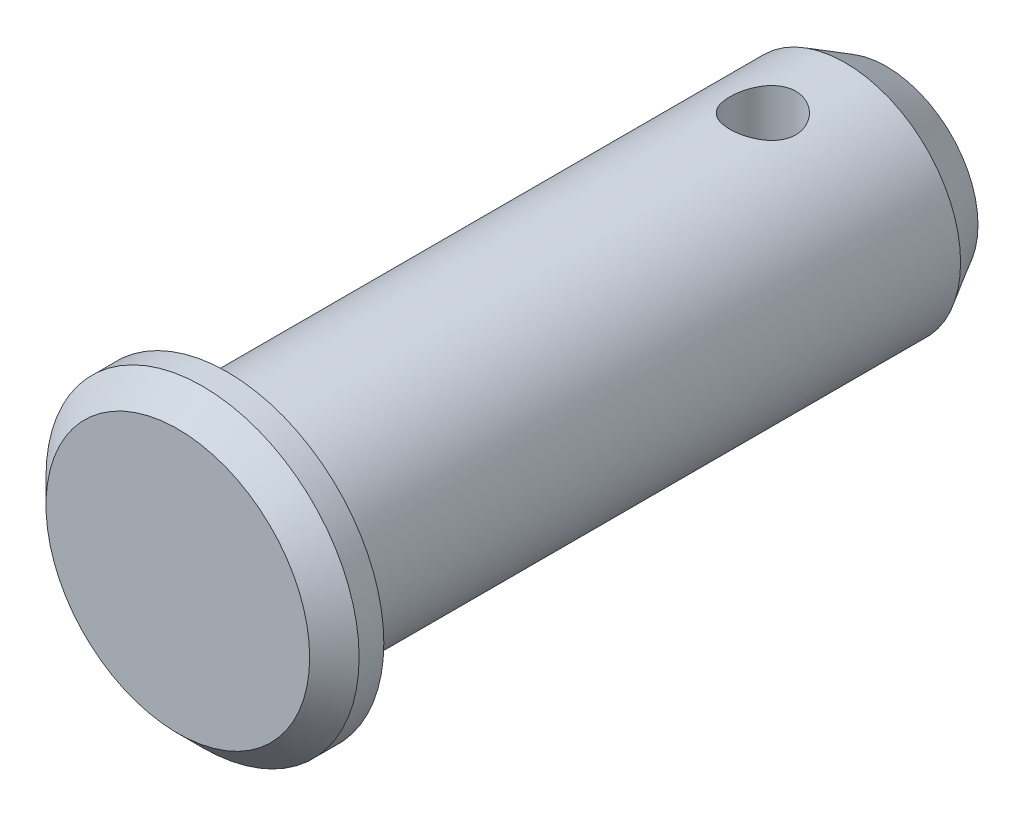
ISO-10303-21;
HEADER;
FILE_DESCRIPTION(('STEP AP214'),'2;1');
FILE_NAME('part.step','',(''),(''),'','','');
FILE_SCHEMA(('AUTOMOTIVE_DESIGN { 1 0 10303 214 1 1 1 1 }'));
ENDSEC;
DATA;
#1=APPLICATION_CONTEXT('core data for automotive mechanical design processes');
#2=APPLICATION_PROTOCOL_DEFINITION('international standard','automotive_design',2000,#1);
#3=PRODUCT_CONTEXT('',#1,'mechanical');
#4=PRODUCT('Part','Part','',(#3));
#5=PRODUCT_RELATED_PRODUCT_CATEGORY('part','',(#4));
#6=PRODUCT_DEFINITION_FORMATION('','',#4);
#7=PRODUCT_DEFINITION_CONTEXT('part definition',#1,'design');
#8=PRODUCT_DEFINITION('design','',#6,#7);
#9=PRODUCT_DEFINITION_SHAPE('','',#8);
#10=(LENGTH_UNIT() NAMED_UNIT(*) SI_UNIT(.MILLI.,.METRE.));
#11=(NAMED_UNIT(*) PLANE_ANGLE_UNIT() SI_UNIT($,.RADIAN.));
#12=(NAMED_UNIT(*) SI_UNIT($,.STERADIAN.) SOLID_ANGLE_UNIT());
#13=UNCERTAINTY_MEASURE_WITH_UNIT(LENGTH_MEASURE(1.E-05),#10,'distance_accuracy_value','');
#14=(GEOMETRIC_REPRESENTATION_CONTEXT(3) GLOBAL_UNCERTAINTY_ASSIGNED_CONTEXT((#13)) GLOBAL_UNIT_ASSIGNED_CONTEXT((#10,
#11,#12)) REPRESENTATION_CONTEXT('',''));
#15=CARTESIAN_POINT('',(0.,0.,0.));
#16=DIRECTION('',(0.,0.,1.));
#17=DIRECTION('',(1.,0.,0.));
#18=AXIS2_PLACEMENT_3D('',#15,#16,#17);
#19=CARTESIAN_POINT('',(0.,0.,21.5));
#20=DIRECTION('',(0.,0.,-1.));
#21=DIRECTION('',(-1.,0.,0.));
#22=AXIS2_PLACEMENT_3D('',#19,#20,#21);
#23=PLANE('',#22);
#24=CARTESIAN_POINT('',(0.,0.,21.5));
#25=DIRECTION('',(0.,0.,1.));
#26=DIRECTION('',(1.,0.,0.));
#27=AXIS2_PLACEMENT_3D('',#24,#25,#26);
#28=CIRCLE('',#27,8.);
#29=CARTESIAN_POINT('',(8.,0.,21.5));
#30=VERTEX_POINT('',#29);
#31=EDGE_CURVE('E10',#30,#30,#28,.T.);
#32=ORIENTED_EDGE('',*,*,#31,.T.);
#33=EDGE_LOOP('',(#32));
#34=FACE_BOUND('',#33,.T.);
#35=ADVANCED_FACE('F33',(#34),#23,.F.);
#36=CARTESIAN_POINT('',(0.,0.,20.));
#37=DIRECTION('',(0.,0.,-1.));
#38=DIRECTION('',(-1.,0.,0.));
#39=AXIS2_PLACEMENT_3D('',#36,#37,#38);
#40=CONICAL_SURFACE('',#39,9.5,0.785398163397447);
#41=ORIENTED_EDGE('',*,*,#31,.F.);
#42=EDGE_LOOP('',(#41));
#43=FACE_BOUND('',#42,.T.);
#44=CARTESIAN_POINT('',(0.,0.,20.));
#45=DIRECTION('',(0.,0.,1.));
#46=DIRECTION('',(1.,0.,0.));
#47=AXIS2_PLACEMENT_3D('',#44,#45,#46);
#48=CIRCLE('',#47,9.5);
#49=CARTESIAN_POINT('',(9.5,0.,20.));
#50=VERTEX_POINT('',#49);
#51=EDGE_CURVE('E45',#50,#50,#48,.T.);
#52=ORIENTED_EDGE('',*,*,#51,.T.);
#53=EDGE_LOOP('',(#52));
#54=FACE_BOUND('',#53,.T.);
#55=ADVANCED_FACE('F82',(#43,#54),#40,.T.);
#56=CARTESIAN_POINT('',(0.,0.,21.5));
#57=DIRECTION('',(0.,0.,1.));
#58=DIRECTION('',(1.,0.,0.));
#59=AXIS2_PLACEMENT_3D('',#56,#57,#58);
#60=CYLINDRICAL_SURFACE('',#59,9.5);
#61=ORIENTED_EDGE('',*,*,#51,.F.);
#62=EDGE_LOOP('',(#61));
#63=FACE_BOUND('',#62,.T.);
#64=CARTESIAN_POINT('',(0.,0.,18.5));
#65=DIRECTION('',(0.,0.,1.));
#66=DIRECTION('',(1.,0.,0.));
#67=AXIS2_PLACEMENT_3D('',#64,#65,#66);
#68=CIRCLE('',#67,9.5);
#69=CARTESIAN_POINT('',(9.5,0.,18.5));
#70=VERTEX_POINT('',#69);
#71=EDGE_CURVE('E50',#70,#70,#68,.T.);
#72=ORIENTED_EDGE('',*,*,#71,.T.);
#73=EDGE_LOOP('',(#72));
#74=FACE_BOUND('',#73,.T.);
#75=ADVANCED_FACE('F86',(#63,#74),#60,.T.);
#76=CARTESIAN_POINT('',(0.,0.,18.5));
#77=DIRECTION('',(0.,0.,1.));
#78=DIRECTION('',(1.,0.,0.));
#79=AXIS2_PLACEMENT_3D('',#76,#77,#78);
#80=PLANE('',#79);
#81=ORIENTED_EDGE('',*,*,#71,.F.);
#82=EDGE_LOOP('',(#81));
#83=FACE_BOUND('',#82,.T.);
#84=CARTESIAN_POINT('',(0.,0.,18.5));
#85=DIRECTION('',(0.,0.,1.));
#86=DIRECTION('',(1.,0.,0.));
#87=AXIS2_PLACEMENT_3D('',#84,#85,#86);
#88=CIRCLE('',#87,7.);
#89=CARTESIAN_POINT('',(7.,0.,18.5));
#90=VERTEX_POINT('',#89);
#91=EDGE_CURVE('E103',#90,#90,#88,.T.);
#92=ORIENTED_EDGE('',*,*,#91,.T.);
#93=EDGE_LOOP('',(#92));
#94=FACE_BOUND('',#93,.T.);
#95=ADVANCED_FACE('F77',(#83,#94),#80,.F.);
#96=CARTESIAN_POINT('',(0.,0.,21.5));
#97=DIRECTION('',(0.,0.,1.));
#98=DIRECTION('',(1.,0.,0.));
#99=AXIS2_PLACEMENT_3D('',#96,#97,#98);
#100=CYLINDRICAL_SURFACE('',#99,7.);
#101=CARTESIAN_POINT('',(0.,-7.,-12.));
#102=CARTESIAN_POINT('',(0.109954902377251,-6.99999869294341,-12.0000019395619));
#103=CARTESIAN_POINT('',(0.219929747872581,-6.99738417402043,-12.0090977889761));
#104=CARTESIAN_POINT('',(0.436691991196989,-6.98720905945103,-12.0451642701023));
#105=CARTESIAN_POINT('',(0.543478166829615,-6.97964659210084,-12.0721416660741));
#106=CARTESIAN_POINT('',(0.750704300737871,-6.96040691349073,-12.1430080384165));
#107=CARTESIAN_POINT('',(0.851152880848224,-6.94873544106341,-12.1868734361519));
#108=CARTESIAN_POINT('',(1.04326876112927,-6.92249978316544,-12.2901779914783));
#109=CARTESIAN_POINT('',(1.13493514117816,-6.90793529508023,-12.3496187784904));
#110=CARTESIAN_POINT('',(1.30929444685895,-6.8770473462558,-12.4840350106729));
#111=CARTESIAN_POINT('',(1.39172372238094,-6.86069041945191,-12.5593447538553));
#112=CARTESIAN_POINT('',(1.54297135792435,-6.82826734915641,-12.7226477431377));
#113=CARTESIAN_POINT('',(1.61178767707782,-6.81220124959344,-12.8106428876322));
#114=CARTESIAN_POINT('',(1.7351979000643,-6.78183014875388,-12.9989935827909));
#115=CARTESIAN_POINT('',(1.78947821103348,-6.76756702506018,-13.0995619850649));
#116=CARTESIAN_POINT('',(1.8802517055398,-6.74291343840667,-13.3088720117508));
#117=CARTESIAN_POINT('',(1.91674871555719,-6.73252214244871,-13.4176118720709));
#118=CARTESIAN_POINT('',(1.96998433013875,-6.71713608196016,-13.6372347631655));
#119=CARTESIAN_POINT('',(1.9872055320285,-6.71200978570011,-13.7479913627678));
#120=CARTESIAN_POINT('',(2.00290667789184,-6.70734208201995,-13.9709311484461));
#121=CARTESIAN_POINT('',(2.00139069409621,-6.70779946107612,-14.0831140192502));
#122=CARTESIAN_POINT('',(1.98004134762903,-6.71413034409934,-14.3018686114562));
#123=CARTESIAN_POINT('',(1.96080325728391,-6.71982782697936,-14.4085043511808));
#124=CARTESIAN_POINT('',(1.90551386085789,-6.73571348382811,-14.6169672196276));
#125=CARTESIAN_POINT('',(1.8694610348125,-6.74590206376403,-14.7187939127205));
#126=CARTESIAN_POINT('',(1.78110681137812,-6.7697686351608,-14.9162462444318));
#127=CARTESIAN_POINT('',(1.72860551172881,-6.78348916405649,-15.0117770724017));
#128=CARTESIAN_POINT('',(1.60898379167885,-6.81285216882059,-15.1928765612134));
#129=CARTESIAN_POINT('',(1.54186011673345,-6.82849507221912,-15.2784429977349));
#130=CARTESIAN_POINT('',(1.39190399673021,-6.86066250656356,-15.4405723756064));
#131=CARTESIAN_POINT('',(1.30857487484533,-6.87719804572366,-15.5166744759672));
#132=CARTESIAN_POINT('',(1.13013228238622,-6.90876247218345,-15.6539260036403));
#133=CARTESIAN_POINT('',(1.03501820148189,-6.92379128137826,-15.7150746560417));
#134=CARTESIAN_POINT('',(0.834923073091445,-6.95076528065502,-15.820928734774));
#135=CARTESIAN_POINT('',(0.729889817810005,-6.96269275497229,-15.8655402868042));
#136=CARTESIAN_POINT('',(0.51339322996747,-6.98199251487585,-15.9363338914168));
#137=CARTESIAN_POINT('',(0.401931525810147,-6.98936594856255,-15.9625205892453));
#138=CARTESIAN_POINT('',(0.17966638864435,-6.99854874514672,-15.9949732857095));
#139=CARTESIAN_POINT('',(0.0689613468605084,-7.00053272850599,-16.001864695373));
#140=CARTESIAN_POINT('',(-0.152026526805583,-6.99922084707091,-15.997272733699));
#141=CARTESIAN_POINT('',(-0.262309407757108,-6.99592561580629,-15.9857915671541));
#142=CARTESIAN_POINT('',(-0.477018633430315,-6.98453926685206,-15.9452895556837));
#143=CARTESIAN_POINT('',(-0.581518211734843,-6.97654613017679,-15.9166268186766));
#144=CARTESIAN_POINT('',(-0.78420868620564,-6.95667998741884,-15.8429994980153));
#145=CARTESIAN_POINT('',(-0.882398851248717,-6.94480653265874,-15.7980330291107));
#146=CARTESIAN_POINT('',(-1.07204168512003,-6.91809961169145,-15.6919766633549));
#147=CARTESIAN_POINT('',(-1.16330248654009,-6.9032076317834,-15.6305588011747));
#148=CARTESIAN_POINT('',(-1.33443852805947,-6.87217947098441,-15.4937474940489));
#149=CARTESIAN_POINT('',(-1.41431117084304,-6.85604300755108,-15.4183508699354));
#150=CARTESIAN_POINT('',(-1.56310642834007,-6.82368619629444,-15.2527906579506));
#151=CARTESIAN_POINT('',(-1.63158542740713,-6.80748036858305,-15.162224724441));
#152=CARTESIAN_POINT('',(-1.75239531606757,-6.77738894734787,-14.9705374113753));
#153=CARTESIAN_POINT('',(-1.8047267674867,-6.76350327310609,-14.8694163992287));
#154=CARTESIAN_POINT('',(-1.89137454118278,-6.73978651242836,-14.6599087890248));
#155=CARTESIAN_POINT('',(-1.92578633239654,-6.72993400029434,-14.5515642365024));
#156=CARTESIAN_POINT('',(-1.9757945006787,-6.71542456669526,-14.3302900644252));
#157=CARTESIAN_POINT('',(-1.99139657901587,-6.71076607094367,-14.2173618449236));
#158=CARTESIAN_POINT('',(-2.00298024246851,-6.70731703127619,-13.9947039670632));
#159=CARTESIAN_POINT('',(-1.99968027644405,-6.70831160808103,-13.8850144954433));
#160=CARTESIAN_POINT('',(-1.97524710957466,-6.71554597206102,-13.6678252693383));
#161=CARTESIAN_POINT('',(-1.95411450379873,-6.72178558421114,-13.5603254419081));
#162=CARTESIAN_POINT('',(-1.89505968816675,-6.73866977160528,-13.3516216288314));
#163=CARTESIAN_POINT('',(-1.85731091786365,-6.74926877048974,-13.2503646129888));
#164=CARTESIAN_POINT('',(-1.76622949301581,-6.77367302842112,-13.0555412655078));
#165=CARTESIAN_POINT('',(-1.71289408043152,-6.78747885482392,-12.9619762987268));
#166=CARTESIAN_POINT('',(-1.59006546534828,-6.81731668949935,-12.7818164781947));
#167=CARTESIAN_POINT('',(-1.52009227722732,-6.83340763179064,-12.695558608658));
#168=CARTESIAN_POINT('',(-1.36685984037935,-6.86569845092232,-12.5357761041902));
#169=CARTESIAN_POINT('',(-1.28359725072856,-6.88189835417168,-12.4622546808892));
#170=CARTESIAN_POINT('',(-1.10357432086539,-6.91307959572365,-12.3281628156734));
#171=CARTESIAN_POINT('',(-1.00652250235978,-6.92801901037413,-12.2679730127304));
#172=CARTESIAN_POINT('',(-0.80325052964666,-6.95451395777971,-12.164854214978));
#173=CARTESIAN_POINT('',(-0.697035424114738,-6.96607133870287,-12.1219157880669));
#174=CARTESIAN_POINT('',(-0.492916315335033,-6.98327344725308,-12.0591524486046));
#175=CARTESIAN_POINT('',(-0.395763007624389,-6.98949684362077,-12.0370264633154));
#176=CARTESIAN_POINT('',(-0.199078368786366,-6.99786043852147,-12.0074503427579));
#177=CARTESIAN_POINT('',(-0.0995473576160912,-7.00000118333996,-11.9999982440231));
#178=CARTESIAN_POINT('',(0.,-7.,-12.));
#179=B_SPLINE_CURVE_WITH_KNOTS('',3,(#101,#102,#103,#104,#105,#106,#107,#108,#109,#110,#111,
#112,#113,#114,#115,#116,#117,#118,#119,#120,#121,#122,#123,#124,#125,#126,#127,#128,#129,#130,
#131,#132,#133,#134,#135,#136,#137,#138,#139,#140,#141,#142,#143,#144,#145,#146,#147,#148,#149,
#150,#151,#152,#153,#154,#155,#156,#157,#158,#159,#160,#161,#162,#163,#164,#165,#166,#167,#168,
#169,#170,#171,#172,#173,#174,#175,#176,#177,#178),.UNSPECIFIED.,.T.,.F.,(4,2,2,2,2,2,2,2,2,2,2,
2,2,2,2,2,2,2,2,2,2,2,2,2,2,2,2,2,2,2,2,2,2,2,2,2,2,2,4),(0.,0.329499312542344,0.65912333979518,
0.988288812895344,1.31748873543516,1.65447811530781,1.99151797873713,2.33533075300057,
2.67906951544809,3.0139950986275,3.34884789231233,3.67284785829333,3.99687711786126,
4.3250080329121,4.65321205577343,4.99378500602502,5.33437560155449,5.67687101104448,
6.01928004014612,6.350454576982,6.68158937434648,7.00605140479519,7.33055096575529,
7.66207525344451,7.99367503187788,8.33612104884334,8.67855514965298,9.01914573366139,
9.35963305787734,9.68726681616472,10.0148896418598,10.3391709629126,10.6635096999758,
10.9986765689036,11.3339278310847,11.6777797897016,12.0214434923409,12.3197946803794,
12.6181059442772),.UNSPECIFIED.);
#180=CARTESIAN_POINT('',(0.,-7.,-12.));
#181=VERTEX_POINT('',#180);
#182=EDGE_CURVE('E36',#181,#181,#179,.T.);
#183=ORIENTED_EDGE('',*,*,#182,.T.);
#184=EDGE_LOOP('',(#183));
#185=FACE_BOUND('',#184,.T.);
#186=CARTESIAN_POINT('',(0.,7.,-12.));
#187=CARTESIAN_POINT('',(-0.109954902377251,6.99999869294341,-12.0000019395619));
#188=CARTESIAN_POINT('',(-0.219929747872581,6.99738417402043,-12.0090977889761));
#189=CARTESIAN_POINT('',(-0.436691991196989,6.98720905945103,-12.0451642701023));
#190=CARTESIAN_POINT('',(-0.543478166829615,6.97964659210084,-12.0721416660741));
#191=CARTESIAN_POINT('',(-0.750704300737871,6.96040691349073,-12.1430080384165));
#192=CARTESIAN_POINT('',(-0.851152880848224,6.94873544106341,-12.1868734361519));
#193=CARTESIAN_POINT('',(-1.04326876112927,6.92249978316544,-12.2901779914783));
#194=CARTESIAN_POINT('',(-1.13493514117816,6.90793529508023,-12.3496187784904));
#195=CARTESIAN_POINT('',(-1.30929444685895,6.8770473462558,-12.4840350106729));
#196=CARTESIAN_POINT('',(-1.39172372238094,6.86069041945191,-12.5593447538553));
#197=CARTESIAN_POINT('',(-1.54297135792435,6.82826734915641,-12.7226477431377));
#198=CARTESIAN_POINT('',(-1.61178767707782,6.81220124959344,-12.8106428876322));
#199=CARTESIAN_POINT('',(-1.7351979000643,6.78183014875388,-12.9989935827909));
#200=CARTESIAN_POINT('',(-1.78947821103348,6.76756702506018,-13.0995619850649));
#201=CARTESIAN_POINT('',(-1.8802517055398,6.74291343840667,-13.3088720117508));
#202=CARTESIAN_POINT('',(-1.91674871555719,6.73252214244871,-13.4176118720709));
#203=CARTESIAN_POINT('',(-1.96998433013875,6.71713608196017,-13.6372347631655));
#204=CARTESIAN_POINT('',(-1.9872055320285,6.71200978570012,-13.7479913627678));
#205=CARTESIAN_POINT('',(-2.00290667789184,6.70734208201995,-13.9709311484461));
#206=CARTESIAN_POINT('',(-2.00139069409621,6.70779946107612,-14.0831140192502));
#207=CARTESIAN_POINT('',(-1.98004134762903,6.71413034409934,-14.3018686114562));
#208=CARTESIAN_POINT('',(-1.96080325728391,6.71982782697936,-14.4085043511808));
#209=CARTESIAN_POINT('',(-1.90551386085789,6.73571348382811,-14.6169672196276));
#210=CARTESIAN_POINT('',(-1.8694610348125,6.74590206376404,-14.7187939127205));
#211=CARTESIAN_POINT('',(-1.78110681137812,6.7697686351608,-14.9162462444318));
#212=CARTESIAN_POINT('',(-1.72860551172881,6.78348916405649,-15.0117770724017));
#213=CARTESIAN_POINT('',(-1.60898379167885,6.81285216882059,-15.1928765612134));
#214=CARTESIAN_POINT('',(-1.54186011673345,6.82849507221913,-15.2784429977349));
#215=CARTESIAN_POINT('',(-1.39190399673021,6.86066250656356,-15.4405723756064));
#216=CARTESIAN_POINT('',(-1.30857487484533,6.87719804572366,-15.5166744759672));
#217=CARTESIAN_POINT('',(-1.13013228238623,6.90876247218345,-15.6539260036403));
#218=CARTESIAN_POINT('',(-1.03501820148189,6.92379128137826,-15.7150746560417));
#219=CARTESIAN_POINT('',(-0.834923073091446,6.95076528065502,-15.820928734774));
#220=CARTESIAN_POINT('',(-0.729889817810005,6.96269275497229,-15.8655402868042));
#221=CARTESIAN_POINT('',(-0.51339322996747,6.98199251487585,-15.9363338914168));
#222=CARTESIAN_POINT('',(-0.401931525810147,6.98936594856255,-15.9625205892453));
#223=CARTESIAN_POINT('',(-0.179666388644351,6.99854874514672,-15.9949732857095));
#224=CARTESIAN_POINT('',(-0.0689613468605094,7.00053272850599,-16.001864695373));
#225=CARTESIAN_POINT('',(0.152026526805582,6.99922084707091,-15.997272733699));
#226=CARTESIAN_POINT('',(0.262309407757107,6.99592561580629,-15.9857915671541));
#227=CARTESIAN_POINT('',(0.477018633430314,6.98453926685206,-15.9452895556837));
#228=CARTESIAN_POINT('',(0.581518211734843,6.97654613017679,-15.9166268186766));
#229=CARTESIAN_POINT('',(0.78420868620564,6.95667998741884,-15.8429994980153));
#230=CARTESIAN_POINT('',(0.882398851248716,6.94480653265874,-15.7980330291107));
#231=CARTESIAN_POINT('',(1.07204168512003,6.91809961169145,-15.6919766633549));
#232=CARTESIAN_POINT('',(1.16330248654009,6.9032076317834,-15.6305588011747));
#233=CARTESIAN_POINT('',(1.33443852805947,6.87217947098441,-15.4937474940489));
#234=CARTESIAN_POINT('',(1.41431117084304,6.85604300755107,-15.4183508699354));
#235=CARTESIAN_POINT('',(1.56310642834007,6.82368619629443,-15.2527906579506));
#236=CARTESIAN_POINT('',(1.63158542740713,6.80748036858305,-15.162224724441));
#237=CARTESIAN_POINT('',(1.75239531606757,6.77738894734787,-14.9705374113753));
#238=CARTESIAN_POINT('',(1.8047267674867,6.76350327310608,-14.8694163992287));
#239=CARTESIAN_POINT('',(1.89137454118278,6.73978651242836,-14.6599087890248));
#240=CARTESIAN_POINT('',(1.92578633239654,6.72993400029434,-14.5515642365024));
#241=CARTESIAN_POINT('',(1.9757945006787,6.71542456669526,-14.3302900644252));
#242=CARTESIAN_POINT('',(1.99139657901587,6.71076607094366,-14.2173618449236));
#243=CARTESIAN_POINT('',(2.00298024246851,6.70731703127619,-13.9947039670632));
#244=CARTESIAN_POINT('',(1.99968027644405,6.70831160808103,-13.8850144954433));
#245=CARTESIAN_POINT('',(1.97524710957466,6.71554597206102,-13.6678252693383));
#246=CARTESIAN_POINT('',(1.95411450379873,6.72178558421114,-13.5603254419081));
#247=CARTESIAN_POINT('',(1.89505968816675,6.73866977160527,-13.3516216288314));
#248=CARTESIAN_POINT('',(1.85731091786365,6.74926877048974,-13.2503646129888));
#249=CARTESIAN_POINT('',(1.76622949301581,6.77367302842112,-13.0555412655078));
#250=CARTESIAN_POINT('',(1.71289408043152,6.78747885482392,-12.9619762987268));
#251=CARTESIAN_POINT('',(1.59006546534828,6.81731668949935,-12.7818164781947));
#252=CARTESIAN_POINT('',(1.52009227722732,6.83340763179064,-12.695558608658));
#253=CARTESIAN_POINT('',(1.36685984037935,6.86569845092232,-12.5357761041902));
#254=CARTESIAN_POINT('',(1.28359725072856,6.88189835417168,-12.4622546808892));
#255=CARTESIAN_POINT('',(1.10357432086539,6.91307959572365,-12.3281628156734));
#256=CARTESIAN_POINT('',(1.00652250235978,6.92801901037413,-12.2679730127304));
#257=CARTESIAN_POINT('',(0.803250529646662,6.95451395777971,-12.164854214978));
#258=CARTESIAN_POINT('',(0.69703542411474,6.96607133870287,-12.1219157880669));
#259=CARTESIAN_POINT('',(0.492916315335036,6.98327344725308,-12.0591524486046));
#260=CARTESIAN_POINT('',(0.395763007624391,6.98949684362077,-12.0370264633154));
#261=CARTESIAN_POINT('',(0.199078368786367,6.99786043852147,-12.0074503427579));
#262=CARTESIAN_POINT('',(0.0995473576160919,7.00000118333996,-11.9999982440231));
#263=CARTESIAN_POINT('',(0.,7.,-12.));
#264=B_SPLINE_CURVE_WITH_KNOTS('',3,(#186,#187,#188,#189,#190,#191,#192,#193,#194,#195,#196,
#197,#198,#199,#200,#201,#202,#203,#204,#205,#206,#207,#208,#209,#210,#211,#212,#213,#214,#215,
#216,#217,#218,#219,#220,#221,#222,#223,#224,#225,#226,#227,#228,#229,#230,#231,#232,#233,#234,
#235,#236,#237,#238,#239,#240,#241,#242,#243,#244,#245,#246,#247,#248,#249,#250,#251,#252,#253,
#254,#255,#256,#257,#258,#259,#260,#261,#262,#263),.UNSPECIFIED.,.T.,.F.,(4,2,2,2,2,2,2,2,2,2,2,
2,2,2,2,2,2,2,2,2,2,2,2,2,2,2,2,2,2,2,2,2,2,2,2,2,2,2,4),(0.,0.329499312542344,0.65912333979518,
0.988288812895344,1.31748873543516,1.65447811530781,1.99151797873713,2.33533075300057,
2.67906951544809,3.01399509862749,3.34884789231233,3.67284785829333,3.99687711786126,
4.3250080329121,4.65321205577343,4.99378500602501,5.33437560155449,5.67687101104448,
6.01928004014612,6.350454576982,6.68158937434648,7.00605140479519,7.33055096575529,
7.66207525344451,7.99367503187787,8.33612104884334,8.67855514965298,9.01914573366139,
9.35963305787734,9.68726681616472,10.0148896418598,10.3391709629126,10.6635096999758,
10.9986765689036,11.3339278310847,11.6777797897016,12.0214434923409,12.3197946803794,
12.6181059442772),.UNSPECIFIED.);
#265=CARTESIAN_POINT('',(0.,7.,-12.));
#266=VERTEX_POINT('',#265);
#267=EDGE_CURVE('E53',#266,#266,#264,.T.);
#268=ORIENTED_EDGE('',*,*,#267,.T.);
#269=EDGE_LOOP('',(#268));
#270=FACE_BOUND('',#269,.T.);
#271=ORIENTED_EDGE('',*,*,#91,.F.);
#272=EDGE_LOOP('',(#271));
#273=FACE_BOUND('',#272,.T.);
#274=CARTESIAN_POINT('',(0.,0.,-19.));
#275=DIRECTION('',(0.,0.,1.));
#276=DIRECTION('',(1.,0.,0.));
#277=AXIS2_PLACEMENT_3D('',#274,#275,#276);
#278=CIRCLE('',#277,7.);
#279=CARTESIAN_POINT('',(7.,0.,-19.));
#280=VERTEX_POINT('',#279);
#281=EDGE_CURVE('E105',#280,#280,#278,.T.);
#282=ORIENTED_EDGE('',*,*,#281,.T.);
#283=EDGE_LOOP('',(#282));
#284=FACE_BOUND('',#283,.T.);
#285=ADVANCED_FACE('F58',(#185,#270,#273,#284),#100,.T.);
#286=CARTESIAN_POINT('',(0.,0.,-21.5));
#287=DIRECTION('',(0.,0.,1.));
#288=DIRECTION('',(1.,0.,0.));
#289=AXIS2_PLACEMENT_3D('',#286,#287,#288);
#290=CONICAL_SURFACE('',#289,5.55662432702594,0.523598775598299);
#291=ORIENTED_EDGE('',*,*,#281,.F.);
#292=EDGE_LOOP('',(#291));
#293=FACE_BOUND('',#292,.T.);
#294=CARTESIAN_POINT('',(0.,0.,-21.5));
#295=DIRECTION('',(0.,0.,1.));
#296=DIRECTION('',(1.,0.,0.));
#297=AXIS2_PLACEMENT_3D('',#294,#295,#296);
#298=CIRCLE('',#297,5.55662432702594);
#299=CARTESIAN_POINT('',(5.55662432702594,0.,-21.5));
#300=VERTEX_POINT('',#299);
#301=EDGE_CURVE('E108',#300,#300,#298,.T.);
#302=ORIENTED_EDGE('',*,*,#301,.T.);
#303=EDGE_LOOP('',(#302));
#304=FACE_BOUND('',#303,.T.);
#305=ADVANCED_FACE('F70',(#293,#304),#290,.T.);
#306=CARTESIAN_POINT('',(0.,0.,-21.5));
#307=DIRECTION('',(0.,0.,1.));
#308=DIRECTION('',(1.,0.,0.));
#309=AXIS2_PLACEMENT_3D('',#306,#307,#308);
#310=PLANE('',#309);
#311=ORIENTED_EDGE('',*,*,#301,.F.);
#312=EDGE_LOOP('',(#311));
#313=FACE_BOUND('',#312,.T.);
#314=ADVANCED_FACE('F66',(#313),#310,.F.);
#315=CARTESIAN_POINT('',(0.,-9.5,-14.));
#316=DIRECTION('',(0.,1.,0.));
#317=DIRECTION('',(0.,0.,1.));
#318=AXIS2_PLACEMENT_3D('',#315,#316,#317);
#319=CYLINDRICAL_SURFACE('',#318,2.);
#320=ORIENTED_EDGE('',*,*,#267,.F.);
#321=EDGE_LOOP('',(#320));
#322=FACE_BOUND('',#321,.T.);
#323=ORIENTED_EDGE('',*,*,#182,.F.);
#324=EDGE_LOOP('',(#323));
#325=FACE_BOUND('',#324,.T.);
#326=ADVANCED_FACE('F62',(#322,#325),#319,.F.);
#327=CLOSED_SHELL('',(#35,#55,#75,#95,#285,#305,#314,#326));
#328=MANIFOLD_SOLID_BREP('B2',#327);
#329=ADVANCED_BREP_SHAPE_REPRESENTATION('',(#18,#328),#14);
#330=SHAPE_DEFINITION_REPRESENTATION(#9,#329);
ENDSEC;
END-ISO-10303-21;
